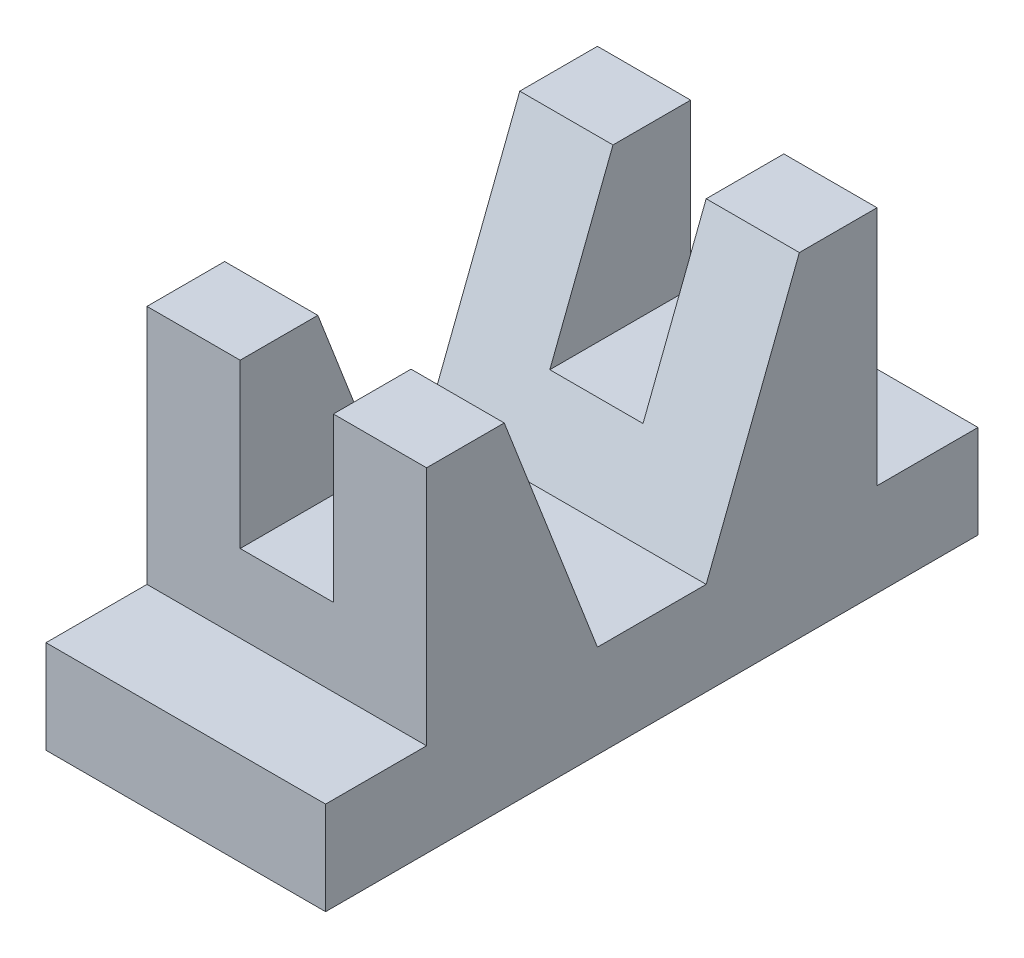
ISO-10303-21;
HEADER;
FILE_DESCRIPTION(('STEP AP214'),'2;1');
FILE_NAME('part.step','',(''),(''),'','','');
FILE_SCHEMA(('AUTOMOTIVE_DESIGN { 1 0 10303 214 1 1 1 1 }'));
ENDSEC;
DATA;
#1=APPLICATION_CONTEXT('core data for automotive mechanical design processes');
#2=APPLICATION_PROTOCOL_DEFINITION('international standard','automotive_design',2000,#1);
#3=PRODUCT_CONTEXT('',#1,'mechanical');
#4=PRODUCT('Part','Part','',(#3));
#5=PRODUCT_RELATED_PRODUCT_CATEGORY('part','',(#4));
#6=PRODUCT_DEFINITION_FORMATION('','',#4);
#7=PRODUCT_DEFINITION_CONTEXT('part definition',#1,'design');
#8=PRODUCT_DEFINITION('design','',#6,#7);
#9=PRODUCT_DEFINITION_SHAPE('','',#8);
#10=(LENGTH_UNIT() NAMED_UNIT(*) SI_UNIT(.MILLI.,.METRE.));
#11=(NAMED_UNIT(*) PLANE_ANGLE_UNIT() SI_UNIT($,.RADIAN.));
#12=(NAMED_UNIT(*) SI_UNIT($,.STERADIAN.) SOLID_ANGLE_UNIT());
#13=UNCERTAINTY_MEASURE_WITH_UNIT(LENGTH_MEASURE(1.E-05),#10,'distance_accuracy_value','');
#14=(GEOMETRIC_REPRESENTATION_CONTEXT(3) GLOBAL_UNCERTAINTY_ASSIGNED_CONTEXT((#13)) GLOBAL_UNIT_ASSIGNED_CONTEXT((#10,
#11,#12)) REPRESENTATION_CONTEXT('',''));
#15=CARTESIAN_POINT('',(0.,0.,0.));
#16=DIRECTION('',(0.,0.,1.));
#17=DIRECTION('',(1.,0.,0.));
#18=AXIS2_PLACEMENT_3D('',#15,#16,#17);
#19=CARTESIAN_POINT('',(36.,43.,-29.));
#20=DIRECTION('',(0.,-1.,0.));
#21=DIRECTION('',(0.,0.,-1.));
#22=AXIS2_PLACEMENT_3D('',#19,#20,#21);
#23=PLANE('',#22);
#24=DIRECTION('',(-1.,0.,0.));
#25=VECTOR('',#24,1.);
#26=CARTESIAN_POINT('',(36.,43.,-19.));
#27=LINE('',#26,#25);
#28=CARTESIAN_POINT('',(12.,43.,-19.));
#29=VERTEX_POINT('',#28);
#30=CARTESIAN_POINT('',(0.,43.,-19.));
#31=VERTEX_POINT('',#30);
#32=EDGE_CURVE('E306',#29,#31,#27,.T.);
#33=ORIENTED_EDGE('',*,*,#32,.F.);
#34=DIRECTION('',(0.,0.,1.));
#35=VECTOR('',#34,1.);
#36=CARTESIAN_POINT('',(12.,43.,-42.));
#37=LINE('',#36,#35);
#38=CARTESIAN_POINT('',(12.,43.,-29.));
#39=VERTEX_POINT('',#38);
#40=EDGE_CURVE('E209',#39,#29,#37,.T.);
#41=ORIENTED_EDGE('',*,*,#40,.F.);
#42=DIRECTION('',(-1.,0.,0.));
#43=VECTOR('',#42,1.);
#44=CARTESIAN_POINT('',(36.,43.,-29.));
#45=LINE('',#44,#43);
#46=CARTESIAN_POINT('',(0.,43.,-29.));
#47=VERTEX_POINT('',#46);
#48=EDGE_CURVE('E310',#39,#47,#45,.T.);
#49=ORIENTED_EDGE('',*,*,#48,.T.);
#50=DIRECTION('',(0.,0.,1.));
#51=VECTOR('',#50,1.);
#52=CARTESIAN_POINT('',(0.,43.,-29.));
#53=LINE('',#52,#51);
#54=EDGE_CURVE('E278',#47,#31,#53,.T.);
#55=ORIENTED_EDGE('',*,*,#54,.T.);
#56=EDGE_LOOP('',(#33,#41,#49,#55));
#57=FACE_BOUND('',#56,.T.);
#58=ADVANCED_FACE('F43',(#57),#23,.F.);
#59=CARTESIAN_POINT('',(36.,43.,29.));
#60=DIRECTION('',(0.,-1.,0.));
#61=DIRECTION('',(0.,0.,-1.));
#62=AXIS2_PLACEMENT_3D('',#59,#60,#61);
#63=PLANE('',#62);
#64=DIRECTION('',(-1.,0.,0.));
#65=VECTOR('',#64,1.);
#66=CARTESIAN_POINT('',(36.,43.,29.));
#67=LINE('',#66,#65);
#68=CARTESIAN_POINT('',(12.,43.,29.));
#69=VERTEX_POINT('',#68);
#70=CARTESIAN_POINT('',(0.,43.,29.));
#71=VERTEX_POINT('',#70);
#72=EDGE_CURVE('E294',#69,#71,#67,.T.);
#73=ORIENTED_EDGE('',*,*,#72,.F.);
#74=CARTESIAN_POINT('',(12.,43.,19.));
#75=VERTEX_POINT('',#74);
#76=EDGE_CURVE('E207',#75,#69,#37,.T.);
#77=ORIENTED_EDGE('',*,*,#76,.F.);
#78=DIRECTION('',(-1.,0.,0.));
#79=VECTOR('',#78,1.);
#80=CARTESIAN_POINT('',(36.,43.,19.));
#81=LINE('',#80,#79);
#82=CARTESIAN_POINT('',(0.,43.,19.));
#83=VERTEX_POINT('',#82);
#84=EDGE_CURVE('E296',#75,#83,#81,.T.);
#85=ORIENTED_EDGE('',*,*,#84,.T.);
#86=DIRECTION('',(0.,0.,1.));
#87=VECTOR('',#86,1.);
#88=CARTESIAN_POINT('',(0.,43.,29.));
#89=LINE('',#88,#87);
#90=EDGE_CURVE('E288',#83,#71,#89,.T.);
#91=ORIENTED_EDGE('',*,*,#90,.T.);
#92=EDGE_LOOP('',(#73,#77,#85,#91));
#93=FACE_BOUND('',#92,.T.);
#94=ADVANCED_FACE('F359',(#93),#63,.F.);
#95=CARTESIAN_POINT('',(36.,12.,42.));
#96=DIRECTION('',(0.,-1.,0.));
#97=DIRECTION('',(0.,0.,-1.));
#98=AXIS2_PLACEMENT_3D('',#95,#96,#97);
#99=PLANE('',#98);
#100=DIRECTION('',(0.,0.,1.));
#101=VECTOR('',#100,1.);
#102=CARTESIAN_POINT('',(0.,12.,42.));
#103=LINE('',#102,#101);
#104=CARTESIAN_POINT('',(0.,12.,29.));
#105=VERTEX_POINT('',#104);
#106=CARTESIAN_POINT('',(0.,12.,42.));
#107=VERTEX_POINT('',#106);
#108=EDGE_CURVE('E237',#105,#107,#103,.T.);
#109=ORIENTED_EDGE('',*,*,#108,.T.);
#110=DIRECTION('',(-1.,0.,0.));
#111=VECTOR('',#110,1.);
#112=CARTESIAN_POINT('',(36.,12.,42.));
#113=LINE('',#112,#111);
#114=CARTESIAN_POINT('',(36.,12.,42.));
#115=VERTEX_POINT('',#114);
#116=EDGE_CURVE('E11',#115,#107,#113,.T.);
#117=ORIENTED_EDGE('',*,*,#116,.F.);
#118=DIRECTION('',(0.,0.,1.));
#119=VECTOR('',#118,1.);
#120=CARTESIAN_POINT('',(36.,12.,42.));
#121=LINE('',#120,#119);
#122=CARTESIAN_POINT('',(36.,12.,29.));
#123=VERTEX_POINT('',#122);
#124=EDGE_CURVE('E238',#123,#115,#121,.T.);
#125=ORIENTED_EDGE('',*,*,#124,.F.);
#126=DIRECTION('',(-1.,0.,0.));
#127=VECTOR('',#126,1.);
#128=CARTESIAN_POINT('',(36.,12.,29.));
#129=LINE('',#128,#127);
#130=EDGE_CURVE('E264',#123,#105,#129,.T.);
#131=ORIENTED_EDGE('',*,*,#130,.T.);
#132=EDGE_LOOP('',(#109,#117,#125,#131));
#133=FACE_BOUND('',#132,.T.);
#134=ADVANCED_FACE('F45',(#133),#99,.F.);
#135=CARTESIAN_POINT('',(36.,0.,42.));
#136=DIRECTION('',(0.,0.,-1.));
#137=DIRECTION('',(-1.,0.,0.));
#138=AXIS2_PLACEMENT_3D('',#135,#136,#137);
#139=PLANE('',#138);
#140=DIRECTION('',(0.,-1.,0.));
#141=VECTOR('',#140,1.);
#142=CARTESIAN_POINT('',(0.,0.,42.));
#143=LINE('',#142,#141);
#144=CARTESIAN_POINT('',(0.,0.,42.));
#145=VERTEX_POINT('',#144);
#146=EDGE_CURVE('E267',#107,#145,#143,.T.);
#147=ORIENTED_EDGE('',*,*,#146,.T.);
#148=DIRECTION('',(-1.,0.,0.));
#149=VECTOR('',#148,1.);
#150=CARTESIAN_POINT('',(36.,0.,42.));
#151=LINE('',#150,#149);
#152=CARTESIAN_POINT('',(36.,0.,42.));
#153=VERTEX_POINT('',#152);
#154=EDGE_CURVE('E51',#153,#145,#151,.T.);
#155=ORIENTED_EDGE('',*,*,#154,.F.);
#156=DIRECTION('',(0.,-1.,0.));
#157=VECTOR('',#156,1.);
#158=CARTESIAN_POINT('',(36.,0.,42.));
#159=LINE('',#158,#157);
#160=EDGE_CURVE('E241',#115,#153,#159,.T.);
#161=ORIENTED_EDGE('',*,*,#160,.F.);
#162=ORIENTED_EDGE('',*,*,#116,.T.);
#163=EDGE_LOOP('',(#147,#155,#161,#162));
#164=FACE_BOUND('',#163,.T.);
#165=ADVANCED_FACE('F350',(#164),#139,.F.);
#166=CARTESIAN_POINT('',(36.,0.,-42.));
#167=DIRECTION('',(0.,1.,0.));
#168=DIRECTION('',(0.,0.,1.));
#169=AXIS2_PLACEMENT_3D('',#166,#167,#168);
#170=PLANE('',#169);
#171=DIRECTION('',(0.,0.,-1.));
#172=VECTOR('',#171,1.);
#173=CARTESIAN_POINT('',(0.,0.,-42.));
#174=LINE('',#173,#172);
#175=CARTESIAN_POINT('',(0.,0.,-42.));
#176=VERTEX_POINT('',#175);
#177=EDGE_CURVE('E269',#145,#176,#174,.T.);
#178=ORIENTED_EDGE('',*,*,#177,.T.);
#179=DIRECTION('',(-1.,0.,0.));
#180=VECTOR('',#179,1.);
#181=CARTESIAN_POINT('',(36.,0.,-42.));
#182=LINE('',#181,#180);
#183=CARTESIAN_POINT('',(36.,0.,-42.));
#184=VERTEX_POINT('',#183);
#185=EDGE_CURVE('E320',#184,#176,#182,.T.);
#186=ORIENTED_EDGE('',*,*,#185,.F.);
#187=DIRECTION('',(0.,0.,-1.));
#188=VECTOR('',#187,1.);
#189=CARTESIAN_POINT('',(36.,0.,-42.));
#190=LINE('',#189,#188);
#191=EDGE_CURVE('E244',#153,#184,#190,.T.);
#192=ORIENTED_EDGE('',*,*,#191,.F.);
#193=ORIENTED_EDGE('',*,*,#154,.T.);
#194=EDGE_LOOP('',(#178,#186,#192,#193));
#195=FACE_BOUND('',#194,.T.);
#196=ADVANCED_FACE('F327',(#195),#170,.F.);
#197=CARTESIAN_POINT('',(36.,0.,-42.));
#198=DIRECTION('',(0.,0.,1.));
#199=DIRECTION('',(1.,0.,0.));
#200=AXIS2_PLACEMENT_3D('',#197,#198,#199);
#201=PLANE('',#200);
#202=DIRECTION('',(0.,1.,0.));
#203=VECTOR('',#202,1.);
#204=CARTESIAN_POINT('',(0.,0.,-42.));
#205=LINE('',#204,#203);
#206=CARTESIAN_POINT('',(0.,12.,-42.));
#207=VERTEX_POINT('',#206);
#208=EDGE_CURVE('E271',#176,#207,#205,.T.);
#209=ORIENTED_EDGE('',*,*,#208,.T.);
#210=DIRECTION('',(-1.,0.,0.));
#211=VECTOR('',#210,1.);
#212=CARTESIAN_POINT('',(36.,12.,-42.));
#213=LINE('',#212,#211);
#214=CARTESIAN_POINT('',(36.,12.,-42.));
#215=VERTEX_POINT('',#214);
#216=EDGE_CURVE('E317',#215,#207,#213,.T.);
#217=ORIENTED_EDGE('',*,*,#216,.F.);
#218=DIRECTION('',(0.,1.,0.));
#219=VECTOR('',#218,1.);
#220=CARTESIAN_POINT('',(36.,0.,-42.));
#221=LINE('',#220,#219);
#222=EDGE_CURVE('E246',#184,#215,#221,.T.);
#223=ORIENTED_EDGE('',*,*,#222,.F.);
#224=ORIENTED_EDGE('',*,*,#185,.T.);
#225=EDGE_LOOP('',(#209,#217,#223,#224));
#226=FACE_BOUND('',#225,.T.);
#227=ADVANCED_FACE('F338',(#226),#201,.F.);
#228=CARTESIAN_POINT('',(36.,12.,-42.));
#229=DIRECTION('',(0.,-1.,0.));
#230=DIRECTION('',(0.,0.,-1.));
#231=AXIS2_PLACEMENT_3D('',#228,#229,#230);
#232=PLANE('',#231);
#233=DIRECTION('',(0.,0.,1.));
#234=VECTOR('',#233,1.);
#235=CARTESIAN_POINT('',(0.,12.,-42.));
#236=LINE('',#235,#234);
#237=CARTESIAN_POINT('',(0.,12.,-29.));
#238=VERTEX_POINT('',#237);
#239=EDGE_CURVE('E273',#207,#238,#236,.T.);
#240=ORIENTED_EDGE('',*,*,#239,.T.);
#241=DIRECTION('',(-1.,0.,0.));
#242=VECTOR('',#241,1.);
#243=CARTESIAN_POINT('',(36.,12.,-29.));
#244=LINE('',#243,#242);
#245=CARTESIAN_POINT('',(36.,12.,-29.));
#246=VERTEX_POINT('',#245);
#247=EDGE_CURVE('E314',#246,#238,#244,.T.);
#248=ORIENTED_EDGE('',*,*,#247,.F.);
#249=DIRECTION('',(0.,0.,1.));
#250=VECTOR('',#249,1.);
#251=CARTESIAN_POINT('',(36.,12.,-42.));
#252=LINE('',#251,#250);
#253=EDGE_CURVE('E248',#215,#246,#252,.T.);
#254=ORIENTED_EDGE('',*,*,#253,.F.);
#255=ORIENTED_EDGE('',*,*,#216,.T.);
#256=EDGE_LOOP('',(#240,#248,#254,#255));
#257=FACE_BOUND('',#256,.T.);
#258=ADVANCED_FACE('F342',(#257),#232,.F.);
#259=CARTESIAN_POINT('',(36.,12.,-29.));
#260=DIRECTION('',(0.,0.,1.));
#261=DIRECTION('',(1.,0.,0.));
#262=AXIS2_PLACEMENT_3D('',#259,#260,#261);
#263=PLANE('',#262);
#264=ORIENTED_EDGE('',*,*,#48,.F.);
#265=DIRECTION('',(0.,-1.,0.));
#266=VECTOR('',#265,1.);
#267=CARTESIAN_POINT('',(12.,12.,-29.));
#268=LINE('',#267,#266);
#269=CARTESIAN_POINT('',(12.,22.,-29.));
#270=VERTEX_POINT('',#269);
#271=EDGE_CURVE('E234',#39,#270,#268,.T.);
#272=ORIENTED_EDGE('',*,*,#271,.T.);
#273=DIRECTION('',(1.,0.,0.));
#274=VECTOR('',#273,1.);
#275=CARTESIAN_POINT('',(36.,22.,-29.));
#276=LINE('',#275,#274);
#277=CARTESIAN_POINT('',(24.,22.,-29.));
#278=VERTEX_POINT('',#277);
#279=EDGE_CURVE('E218',#270,#278,#276,.T.);
#280=ORIENTED_EDGE('',*,*,#279,.T.);
#281=DIRECTION('',(0.,1.,0.));
#282=VECTOR('',#281,1.);
#283=CARTESIAN_POINT('',(24.,12.,-29.));
#284=LINE('',#283,#282);
#285=CARTESIAN_POINT('',(24.,43.,-29.));
#286=VERTEX_POINT('',#285);
#287=EDGE_CURVE('E225',#278,#286,#284,.T.);
#288=ORIENTED_EDGE('',*,*,#287,.T.);
#289=CARTESIAN_POINT('',(36.,43.,-29.));
#290=VERTEX_POINT('',#289);
#291=EDGE_CURVE('E311',#290,#286,#45,.T.);
#292=ORIENTED_EDGE('',*,*,#291,.F.);
#293=DIRECTION('',(0.,1.,0.));
#294=VECTOR('',#293,1.);
#295=CARTESIAN_POINT('',(36.,12.,-29.));
#296=LINE('',#295,#294);
#297=EDGE_CURVE('E250',#246,#290,#296,.T.);
#298=ORIENTED_EDGE('',*,*,#297,.F.);
#299=ORIENTED_EDGE('',*,*,#247,.T.);
#300=DIRECTION('',(0.,1.,0.));
#301=VECTOR('',#300,1.);
#302=CARTESIAN_POINT('',(0.,12.,-29.));
#303=LINE('',#302,#301);
#304=EDGE_CURVE('E275',#238,#47,#303,.T.);
#305=ORIENTED_EDGE('',*,*,#304,.T.);
#306=EDGE_LOOP('',(#264,#272,#280,#288,#292,#298,#299,#305));
#307=FACE_BOUND('',#306,.T.);
#308=ADVANCED_FACE('F380',(#307),#263,.F.);
#309=ORIENTED_EDGE('',*,*,#291,.T.);
#310=DIRECTION('',(0.,0.,1.));
#311=VECTOR('',#310,1.);
#312=CARTESIAN_POINT('',(24.,43.,-42.));
#313=LINE('',#312,#311);
#314=CARTESIAN_POINT('',(24.,43.,-19.));
#315=VERTEX_POINT('',#314);
#316=EDGE_CURVE('E210',#286,#315,#313,.T.);
#317=ORIENTED_EDGE('',*,*,#316,.T.);
#318=CARTESIAN_POINT('',(36.,43.,-19.));
#319=VERTEX_POINT('',#318);
#320=EDGE_CURVE('E307',#319,#315,#27,.T.);
#321=ORIENTED_EDGE('',*,*,#320,.F.);
#322=DIRECTION('',(0.,0.,1.));
#323=VECTOR('',#322,1.);
#324=CARTESIAN_POINT('',(36.,43.,-29.));
#325=LINE('',#324,#323);
#326=EDGE_CURVE('E252',#290,#319,#325,.T.);
#327=ORIENTED_EDGE('',*,*,#326,.F.);
#328=EDGE_LOOP('',(#309,#317,#321,#327));
#329=FACE_BOUND('',#328,.T.);
#330=ADVANCED_FACE('F385',(#329),#23,.F.);
#331=CARTESIAN_POINT('',(36.,43.,-19.));
#332=DIRECTION('',(0.,-0.360994102557712,-0.93256809827409));
#333=DIRECTION('',(0.,0.93256809827409,-0.360994102557712));
#334=AXIS2_PLACEMENT_3D('',#331,#332,#333);
#335=PLANE('',#334);
#336=DIRECTION('',(-1.,0.,0.));
#337=VECTOR('',#336,1.);
#338=CARTESIAN_POINT('',(36.,22.,-10.8709677419355));
#339=LINE('',#338,#337);
#340=CARTESIAN_POINT('',(24.,22.,-10.8709677419355));
#341=VERTEX_POINT('',#340);
#342=CARTESIAN_POINT('',(12.,22.,-10.8709677419355));
#343=VERTEX_POINT('',#342);
#344=EDGE_CURVE('E215',#341,#343,#339,.T.);
#345=ORIENTED_EDGE('',*,*,#344,.T.);
#346=DIRECTION('',(0.,0.93256809827409,-0.360994102557712));
#347=VECTOR('',#346,1.);
#348=CARTESIAN_POINT('',(12.,43.,-19.));
#349=LINE('',#348,#347);
#350=EDGE_CURVE('E231',#343,#29,#349,.T.);
#351=ORIENTED_EDGE('',*,*,#350,.T.);
#352=ORIENTED_EDGE('',*,*,#32,.T.);
#353=DIRECTION('',(0.,-0.93256809827409,0.360994102557712));
#354=VECTOR('',#353,1.);
#355=CARTESIAN_POINT('',(0.,43.,-19.));
#356=LINE('',#355,#354);
#357=CARTESIAN_POINT('',(0.,12.,-7.));
#358=VERTEX_POINT('',#357);
#359=EDGE_CURVE('E281',#31,#358,#356,.T.);
#360=ORIENTED_EDGE('',*,*,#359,.T.);
#361=DIRECTION('',(-1.,0.,0.));
#362=VECTOR('',#361,1.);
#363=CARTESIAN_POINT('',(36.,12.,-7.));
#364=LINE('',#363,#362);
#365=CARTESIAN_POINT('',(36.,12.,-7.));
#366=VERTEX_POINT('',#365);
#367=EDGE_CURVE('E303',#366,#358,#364,.T.);
#368=ORIENTED_EDGE('',*,*,#367,.F.);
#369=DIRECTION('',(0.,-0.93256809827409,0.360994102557712));
#370=VECTOR('',#369,1.);
#371=CARTESIAN_POINT('',(36.,43.,-19.));
#372=LINE('',#371,#370);
#373=EDGE_CURVE('E254',#319,#366,#372,.T.);
#374=ORIENTED_EDGE('',*,*,#373,.F.);
#375=ORIENTED_EDGE('',*,*,#320,.T.);
#376=DIRECTION('',(0.,-0.93256809827409,0.360994102557712));
#377=VECTOR('',#376,1.);
#378=CARTESIAN_POINT('',(24.,43.,-19.));
#379=LINE('',#378,#377);
#380=EDGE_CURVE('E222',#315,#341,#379,.T.);
#381=ORIENTED_EDGE('',*,*,#380,.T.);
#382=EDGE_LOOP('',(#345,#351,#352,#360,#368,#374,#375,#381));
#383=FACE_BOUND('',#382,.T.);
#384=ADVANCED_FACE('F374',(#383),#335,.F.);
#385=CARTESIAN_POINT('',(36.,12.,7.));
#386=DIRECTION('',(0.,-1.,0.));
#387=DIRECTION('',(0.,0.,-1.));
#388=AXIS2_PLACEMENT_3D('',#385,#386,#387);
#389=PLANE('',#388);
#390=DIRECTION('',(0.,0.,1.));
#391=VECTOR('',#390,1.);
#392=CARTESIAN_POINT('',(0.,12.,7.));
#393=LINE('',#392,#391);
#394=CARTESIAN_POINT('',(0.,12.,7.));
#395=VERTEX_POINT('',#394);
#396=EDGE_CURVE('E283',#358,#395,#393,.T.);
#397=ORIENTED_EDGE('',*,*,#396,.T.);
#398=DIRECTION('',(-1.,0.,0.));
#399=VECTOR('',#398,1.);
#400=CARTESIAN_POINT('',(36.,12.,7.));
#401=LINE('',#400,#399);
#402=CARTESIAN_POINT('',(36.,12.,7.));
#403=VERTEX_POINT('',#402);
#404=EDGE_CURVE('E300',#403,#395,#401,.T.);
#405=ORIENTED_EDGE('',*,*,#404,.F.);
#406=DIRECTION('',(0.,0.,1.));
#407=VECTOR('',#406,1.);
#408=CARTESIAN_POINT('',(36.,12.,7.));
#409=LINE('',#408,#407);
#410=EDGE_CURVE('E256',#366,#403,#409,.T.);
#411=ORIENTED_EDGE('',*,*,#410,.F.);
#412=ORIENTED_EDGE('',*,*,#367,.T.);
#413=EDGE_LOOP('',(#397,#405,#411,#412));
#414=FACE_BOUND('',#413,.T.);
#415=ADVANCED_FACE('F369',(#414),#389,.F.);
#416=CARTESIAN_POINT('',(36.,43.,19.));
#417=DIRECTION('',(0.,-0.360994102557712,0.93256809827409));
#418=DIRECTION('',(0.,-0.93256809827409,-0.360994102557712));
#419=AXIS2_PLACEMENT_3D('',#416,#417,#418);
#420=PLANE('',#419);
#421=ORIENTED_EDGE('',*,*,#84,.F.);
#422=DIRECTION('',(0.,-0.93256809827409,-0.360994102557712));
#423=VECTOR('',#422,1.);
#424=CARTESIAN_POINT('',(12.,43.,19.));
#425=LINE('',#424,#423);
#426=CARTESIAN_POINT('',(12.,22.,10.8709677419355));
#427=VERTEX_POINT('',#426);
#428=EDGE_CURVE('E228',#75,#427,#425,.T.);
#429=ORIENTED_EDGE('',*,*,#428,.T.);
#430=DIRECTION('',(1.,0.,0.));
#431=VECTOR('',#430,1.);
#432=CARTESIAN_POINT('',(36.,22.,10.8709677419355));
#433=LINE('',#432,#431);
#434=CARTESIAN_POINT('',(24.,22.,10.8709677419355));
#435=VERTEX_POINT('',#434);
#436=EDGE_CURVE('E213',#427,#435,#433,.T.);
#437=ORIENTED_EDGE('',*,*,#436,.T.);
#438=DIRECTION('',(0.,0.93256809827409,0.360994102557712));
#439=VECTOR('',#438,1.);
#440=CARTESIAN_POINT('',(24.,43.,19.));
#441=LINE('',#440,#439);
#442=CARTESIAN_POINT('',(24.,43.,19.));
#443=VERTEX_POINT('',#442);
#444=EDGE_CURVE('E187',#435,#443,#441,.T.);
#445=ORIENTED_EDGE('',*,*,#444,.T.);
#446=CARTESIAN_POINT('',(36.,43.,19.));
#447=VERTEX_POINT('',#446);
#448=EDGE_CURVE('E297',#447,#443,#81,.T.);
#449=ORIENTED_EDGE('',*,*,#448,.F.);
#450=DIRECTION('',(0.,0.93256809827409,0.360994102557712));
#451=VECTOR('',#450,1.);
#452=CARTESIAN_POINT('',(36.,43.,19.));
#453=LINE('',#452,#451);
#454=EDGE_CURVE('E258',#403,#447,#453,.T.);
#455=ORIENTED_EDGE('',*,*,#454,.F.);
#456=ORIENTED_EDGE('',*,*,#404,.T.);
#457=DIRECTION('',(0.,0.93256809827409,0.360994102557712));
#458=VECTOR('',#457,1.);
#459=CARTESIAN_POINT('',(0.,43.,19.));
#460=LINE('',#459,#458);
#461=EDGE_CURVE('E285',#395,#83,#460,.T.);
#462=ORIENTED_EDGE('',*,*,#461,.T.);
#463=EDGE_LOOP('',(#421,#429,#437,#445,#449,#455,#456,#462));
#464=FACE_BOUND('',#463,.T.);
#465=ADVANCED_FACE('F362',(#464),#420,.F.);
#466=ORIENTED_EDGE('',*,*,#448,.T.);
#467=CARTESIAN_POINT('',(24.,43.,29.));
#468=VERTEX_POINT('',#467);
#469=EDGE_CURVE('E211',#443,#468,#313,.T.);
#470=ORIENTED_EDGE('',*,*,#469,.T.);
#471=CARTESIAN_POINT('',(36.,43.,29.));
#472=VERTEX_POINT('',#471);
#473=EDGE_CURVE('E202',#472,#468,#67,.T.);
#474=ORIENTED_EDGE('',*,*,#473,.F.);
#475=DIRECTION('',(0.,0.,1.));
#476=VECTOR('',#475,1.);
#477=CARTESIAN_POINT('',(36.,43.,29.));
#478=LINE('',#477,#476);
#479=EDGE_CURVE('E260',#447,#472,#478,.T.);
#480=ORIENTED_EDGE('',*,*,#479,.F.);
#481=EDGE_LOOP('',(#466,#470,#474,#480));
#482=FACE_BOUND('',#481,.T.);
#483=ADVANCED_FACE('F389',(#482),#63,.F.);
#484=CARTESIAN_POINT('',(36.,12.,29.));
#485=DIRECTION('',(0.,0.,-1.));
#486=DIRECTION('',(-1.,0.,0.));
#487=AXIS2_PLACEMENT_3D('',#484,#485,#486);
#488=PLANE('',#487);
#489=DIRECTION('',(1.,0.,0.));
#490=VECTOR('',#489,1.);
#491=CARTESIAN_POINT('',(12.,22.,29.));
#492=LINE('',#491,#490);
#493=CARTESIAN_POINT('',(12.,22.,29.));
#494=VERTEX_POINT('',#493);
#495=CARTESIAN_POINT('',(24.,22.,29.));
#496=VERTEX_POINT('',#495);
#497=EDGE_CURVE('E193',#494,#496,#492,.T.);
#498=ORIENTED_EDGE('',*,*,#497,.F.);
#499=DIRECTION('',(0.,-1.,0.));
#500=VECTOR('',#499,1.);
#501=CARTESIAN_POINT('',(12.,43.,29.));
#502=LINE('',#501,#500);
#503=EDGE_CURVE('E66',#69,#494,#502,.T.);
#504=ORIENTED_EDGE('',*,*,#503,.F.);
#505=ORIENTED_EDGE('',*,*,#72,.T.);
#506=DIRECTION('',(0.,-1.,0.));
#507=VECTOR('',#506,1.);
#508=CARTESIAN_POINT('',(0.,12.,29.));
#509=LINE('',#508,#507);
#510=EDGE_CURVE('E242',#71,#105,#509,.T.);
#511=ORIENTED_EDGE('',*,*,#510,.T.);
#512=ORIENTED_EDGE('',*,*,#130,.F.);
#513=DIRECTION('',(0.,-1.,0.));
#514=VECTOR('',#513,1.);
#515=CARTESIAN_POINT('',(36.,12.,29.));
#516=LINE('',#515,#514);
#517=EDGE_CURVE('E262',#472,#123,#516,.T.);
#518=ORIENTED_EDGE('',*,*,#517,.F.);
#519=ORIENTED_EDGE('',*,*,#473,.T.);
#520=DIRECTION('',(0.,1.,0.));
#521=VECTOR('',#520,1.);
#522=CARTESIAN_POINT('',(24.,43.,29.));
#523=LINE('',#522,#521);
#524=EDGE_CURVE('E184',#496,#468,#523,.T.);
#525=ORIENTED_EDGE('',*,*,#524,.F.);
#526=EDGE_LOOP('',(#498,#504,#505,#511,#512,#518,#519,#525));
#527=FACE_BOUND('',#526,.T.);
#528=ADVANCED_FACE('F199',(#527),#488,.F.);
#529=CARTESIAN_POINT('',(36.,0.,0.));
#530=DIRECTION('',(1.,0.,0.));
#531=DIRECTION('',(0.,0.,-1.));
#532=AXIS2_PLACEMENT_3D('',#529,#530,#531);
#533=PLANE('',#532);
#534=ORIENTED_EDGE('',*,*,#124,.T.);
#535=ORIENTED_EDGE('',*,*,#160,.T.);
#536=ORIENTED_EDGE('',*,*,#191,.T.);
#537=ORIENTED_EDGE('',*,*,#222,.T.);
#538=ORIENTED_EDGE('',*,*,#253,.T.);
#539=ORIENTED_EDGE('',*,*,#297,.T.);
#540=ORIENTED_EDGE('',*,*,#326,.T.);
#541=ORIENTED_EDGE('',*,*,#373,.T.);
#542=ORIENTED_EDGE('',*,*,#410,.T.);
#543=ORIENTED_EDGE('',*,*,#454,.T.);
#544=ORIENTED_EDGE('',*,*,#479,.T.);
#545=ORIENTED_EDGE('',*,*,#517,.T.);
#546=EDGE_LOOP('',(#534,#535,#536,#537,#538,#539,#540,#541,#542,#543,#544,#545));
#547=FACE_BOUND('',#546,.T.);
#548=ADVANCED_FACE('F346',(#547),#533,.T.);
#549=CARTESIAN_POINT('',(0.,0.,0.));
#550=DIRECTION('',(1.,0.,0.));
#551=DIRECTION('',(0.,0.,-1.));
#552=AXIS2_PLACEMENT_3D('',#549,#550,#551);
#553=PLANE('',#552);
#554=ORIENTED_EDGE('',*,*,#108,.F.);
#555=ORIENTED_EDGE('',*,*,#510,.F.);
#556=ORIENTED_EDGE('',*,*,#90,.F.);
#557=ORIENTED_EDGE('',*,*,#461,.F.);
#558=ORIENTED_EDGE('',*,*,#396,.F.);
#559=ORIENTED_EDGE('',*,*,#359,.F.);
#560=ORIENTED_EDGE('',*,*,#54,.F.);
#561=ORIENTED_EDGE('',*,*,#304,.F.);
#562=ORIENTED_EDGE('',*,*,#239,.F.);
#563=ORIENTED_EDGE('',*,*,#208,.F.);
#564=ORIENTED_EDGE('',*,*,#177,.F.);
#565=ORIENTED_EDGE('',*,*,#146,.F.);
#566=EDGE_LOOP('',(#554,#555,#556,#557,#558,#559,#560,#561,#562,#563,#564,#565));
#567=FACE_BOUND('',#566,.T.);
#568=ADVANCED_FACE('F333',(#567),#553,.F.);
#569=CARTESIAN_POINT('',(12.,22.,-42.));
#570=DIRECTION('',(0.,-1.,0.));
#571=DIRECTION('',(0.,0.,-1.));
#572=AXIS2_PLACEMENT_3D('',#569,#570,#571);
#573=PLANE('',#572);
#574=DIRECTION('',(0.,0.,1.));
#575=VECTOR('',#574,1.);
#576=CARTESIAN_POINT('',(12.,22.,-42.));
#577=LINE('',#576,#575);
#578=EDGE_CURVE('E195',#427,#494,#577,.T.);
#579=ORIENTED_EDGE('',*,*,#578,.T.);
#580=ORIENTED_EDGE('',*,*,#497,.T.);
#581=DIRECTION('',(0.,0.,1.));
#582=VECTOR('',#581,1.);
#583=CARTESIAN_POINT('',(24.,22.,-42.));
#584=LINE('',#583,#582);
#585=EDGE_CURVE('E180',#435,#496,#584,.T.);
#586=ORIENTED_EDGE('',*,*,#585,.F.);
#587=ORIENTED_EDGE('',*,*,#436,.F.);
#588=EDGE_LOOP('',(#579,#580,#586,#587));
#589=FACE_BOUND('',#588,.T.);
#590=ADVANCED_FACE('F194',(#589),#573,.F.);
#591=CARTESIAN_POINT('',(24.,43.,-42.));
#592=DIRECTION('',(1.,0.,0.));
#593=DIRECTION('',(0.,1.,0.));
#594=AXIS2_PLACEMENT_3D('',#591,#592,#593);
#595=PLANE('',#594);
#596=ORIENTED_EDGE('',*,*,#585,.T.);
#597=ORIENTED_EDGE('',*,*,#524,.T.);
#598=ORIENTED_EDGE('',*,*,#469,.F.);
#599=ORIENTED_EDGE('',*,*,#444,.F.);
#600=EDGE_LOOP('',(#596,#597,#598,#599));
#601=FACE_BOUND('',#600,.T.);
#602=ADVANCED_FACE('F182',(#601),#595,.F.);
#603=CARTESIAN_POINT('',(12.,43.,-42.));
#604=DIRECTION('',(-1.,0.,0.));
#605=DIRECTION('',(0.,-1.,0.));
#606=AXIS2_PLACEMENT_3D('',#603,#604,#605);
#607=PLANE('',#606);
#608=ORIENTED_EDGE('',*,*,#76,.T.);
#609=ORIENTED_EDGE('',*,*,#503,.T.);
#610=ORIENTED_EDGE('',*,*,#578,.F.);
#611=ORIENTED_EDGE('',*,*,#428,.F.);
#612=EDGE_LOOP('',(#608,#609,#610,#611));
#613=FACE_BOUND('',#612,.T.);
#614=ADVANCED_FACE('F494',(#613),#607,.F.);
#615=ORIENTED_EDGE('',*,*,#40,.T.);
#616=ORIENTED_EDGE('',*,*,#350,.F.);
#617=EDGE_CURVE('E58',#270,#343,#577,.T.);
#618=ORIENTED_EDGE('',*,*,#617,.F.);
#619=ORIENTED_EDGE('',*,*,#271,.F.);
#620=EDGE_LOOP('',(#615,#616,#618,#619));
#621=FACE_BOUND('',#620,.T.);
#622=ADVANCED_FACE('F502',(#621),#607,.F.);
#623=EDGE_CURVE('E190',#278,#341,#584,.T.);
#624=ORIENTED_EDGE('',*,*,#623,.T.);
#625=ORIENTED_EDGE('',*,*,#380,.F.);
#626=ORIENTED_EDGE('',*,*,#316,.F.);
#627=ORIENTED_EDGE('',*,*,#287,.F.);
#628=EDGE_LOOP('',(#624,#625,#626,#627));
#629=FACE_BOUND('',#628,.T.);
#630=ADVANCED_FACE('F496',(#629),#595,.F.);
#631=ORIENTED_EDGE('',*,*,#617,.T.);
#632=ORIENTED_EDGE('',*,*,#344,.F.);
#633=ORIENTED_EDGE('',*,*,#623,.F.);
#634=ORIENTED_EDGE('',*,*,#279,.F.);
#635=EDGE_LOOP('',(#631,#632,#633,#634));
#636=FACE_BOUND('',#635,.T.);
#637=ADVANCED_FACE('F488',(#636),#573,.F.);
#638=CLOSED_SHELL('',(#58,#94,#134,#165,#196,#227,#258,#308,#330,#384,#415,#465,#483,#528,#548,
#568,#590,#602,#614,#622,#630,#637));
#639=MANIFOLD_SOLID_BREP('B2',#638);
#640=ADVANCED_BREP_SHAPE_REPRESENTATION('',(#18,#639),#14);
#641=SHAPE_DEFINITION_REPRESENTATION(#9,#640);
ENDSEC;
END-ISO-10303-21;
